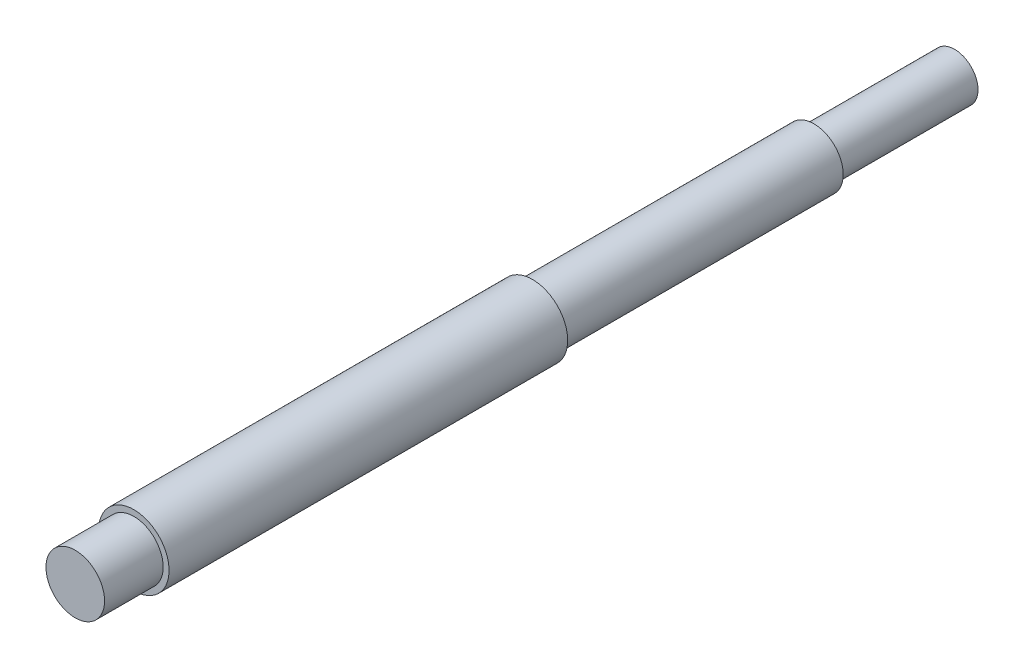
ISO-10303-21;
HEADER;
FILE_DESCRIPTION(('STEP AP214'),'2;1');
FILE_NAME('part.step','',(''),(''),'','','');
FILE_SCHEMA(('AUTOMOTIVE_DESIGN { 1 0 10303 214 1 1 1 1 }'));
ENDSEC;
DATA;
#1=APPLICATION_CONTEXT('core data for automotive mechanical design processes');
#2=APPLICATION_PROTOCOL_DEFINITION('international standard','automotive_design',2000,#1);
#3=PRODUCT_CONTEXT('',#1,'mechanical');
#4=PRODUCT('Part','Part','',(#3));
#5=PRODUCT_RELATED_PRODUCT_CATEGORY('part','',(#4));
#6=PRODUCT_DEFINITION_FORMATION('','',#4);
#7=PRODUCT_DEFINITION_CONTEXT('part definition',#1,'design');
#8=PRODUCT_DEFINITION('design','',#6,#7);
#9=PRODUCT_DEFINITION_SHAPE('','',#8);
#10=(LENGTH_UNIT() NAMED_UNIT(*) SI_UNIT(.MILLI.,.METRE.));
#11=(NAMED_UNIT(*) PLANE_ANGLE_UNIT() SI_UNIT($,.RADIAN.));
#12=(NAMED_UNIT(*) SI_UNIT($,.STERADIAN.) SOLID_ANGLE_UNIT());
#13=UNCERTAINTY_MEASURE_WITH_UNIT(LENGTH_MEASURE(1.E-05),#10,'distance_accuracy_value','');
#14=(GEOMETRIC_REPRESENTATION_CONTEXT(3) GLOBAL_UNCERTAINTY_ASSIGNED_CONTEXT((#13)) GLOBAL_UNIT_ASSIGNED_CONTEXT((#10,
#11,#12)) REPRESENTATION_CONTEXT('',''));
#15=CARTESIAN_POINT('',(0.,0.,0.));
#16=DIRECTION('',(0.,0.,1.));
#17=DIRECTION('',(1.,0.,0.));
#18=AXIS2_PLACEMENT_3D('',#15,#16,#17);
#19=CARTESIAN_POINT('',(0.,0.,5.));
#20=DIRECTION('',(0.,0.,-1.));
#21=DIRECTION('',(-1.,0.,0.));
#22=AXIS2_PLACEMENT_3D('',#19,#20,#21);
#23=CYLINDRICAL_SURFACE('',#22,2.5);
#24=CARTESIAN_POINT('',(0.,0.,5.));
#25=DIRECTION('',(0.,0.,1.));
#26=DIRECTION('',(1.,0.,0.));
#27=AXIS2_PLACEMENT_3D('',#24,#25,#26);
#28=CIRCLE('',#27,2.5);
#29=CARTESIAN_POINT('',(2.5,0.,5.));
#30=VERTEX_POINT('',#29);
#31=EDGE_CURVE('E49',#30,#30,#28,.T.);
#32=ORIENTED_EDGE('',*,*,#31,.F.);
#33=EDGE_LOOP('',(#32));
#34=FACE_BOUND('',#33,.T.);
#35=CARTESIAN_POINT('',(0.,0.,0.));
#36=DIRECTION('',(0.,0.,1.));
#37=DIRECTION('',(1.,0.,0.));
#38=AXIS2_PLACEMENT_3D('',#35,#36,#37);
#39=CIRCLE('',#38,2.5);
#40=CARTESIAN_POINT('',(2.5,0.,0.));
#41=VERTEX_POINT('',#40);
#42=EDGE_CURVE('E40',#41,#41,#39,.T.);
#43=ORIENTED_EDGE('',*,*,#42,.T.);
#44=EDGE_LOOP('',(#43));
#45=FACE_BOUND('',#44,.T.);
#46=ADVANCED_FACE('F37',(#34,#45),#23,.T.);
#47=CARTESIAN_POINT('',(0.,0.,5.));
#48=DIRECTION('',(0.,0.,1.));
#49=DIRECTION('',(1.,0.,0.));
#50=AXIS2_PLACEMENT_3D('',#47,#48,#49);
#51=PLANE('',#50);
#52=ORIENTED_EDGE('',*,*,#31,.T.);
#53=EDGE_LOOP('',(#52));
#54=FACE_BOUND('',#53,.T.);
#55=ADVANCED_FACE('F79',(#54),#51,.T.);
#56=CARTESIAN_POINT('',(0.,0.,-34.));
#57=DIRECTION('',(0.,0.,1.));
#58=DIRECTION('',(1.,0.,0.));
#59=AXIS2_PLACEMENT_3D('',#56,#57,#58);
#60=CYLINDRICAL_SURFACE('',#59,3.);
#61=CARTESIAN_POINT('',(0.,0.,-34.));
#62=DIRECTION('',(0.,0.,-1.));
#63=DIRECTION('',(-1.,0.,0.));
#64=AXIS2_PLACEMENT_3D('',#61,#62,#63);
#65=CIRCLE('',#64,3.);
#66=CARTESIAN_POINT('',(-3.,0.,-34.));
#67=VERTEX_POINT('',#66);
#68=EDGE_CURVE('E58',#67,#67,#65,.T.);
#69=ORIENTED_EDGE('',*,*,#68,.F.);
#70=EDGE_LOOP('',(#69));
#71=FACE_BOUND('',#70,.T.);
#72=CARTESIAN_POINT('',(0.,0.,0.));
#73=DIRECTION('',(0.,0.,-1.));
#74=DIRECTION('',(-1.,0.,0.));
#75=AXIS2_PLACEMENT_3D('',#72,#73,#74);
#76=CIRCLE('',#75,3.);
#77=CARTESIAN_POINT('',(-3.,0.,0.));
#78=VERTEX_POINT('',#77);
#79=EDGE_CURVE('E56',#78,#78,#76,.T.);
#80=ORIENTED_EDGE('',*,*,#79,.T.);
#81=EDGE_LOOP('',(#80));
#82=FACE_BOUND('',#81,.T.);
#83=ADVANCED_FACE('F77',(#71,#82),#60,.T.);
#84=CARTESIAN_POINT('',(0.,0.,-34.));
#85=DIRECTION('',(0.,0.,-1.));
#86=DIRECTION('',(-1.,0.,0.));
#87=AXIS2_PLACEMENT_3D('',#84,#85,#86);
#88=PLANE('',#87);
#89=CARTESIAN_POINT('',(0.,0.,-34.));
#90=DIRECTION('',(0.,0.,-1.));
#91=DIRECTION('',(-1.,0.,0.));
#92=AXIS2_PLACEMENT_3D('',#89,#90,#91);
#93=CIRCLE('',#92,2.5);
#94=CARTESIAN_POINT('',(-2.5,0.,-34.));
#95=VERTEX_POINT('',#94);
#96=EDGE_CURVE('E44',#95,#95,#93,.T.);
#97=ORIENTED_EDGE('',*,*,#96,.F.);
#98=EDGE_LOOP('',(#97));
#99=FACE_BOUND('',#98,.T.);
#100=ORIENTED_EDGE('',*,*,#68,.T.);
#101=EDGE_LOOP('',(#100));
#102=FACE_BOUND('',#101,.T.);
#103=ADVANCED_FACE('F73',(#99,#102),#88,.T.);
#104=CARTESIAN_POINT('',(0.,0.,0.));
#105=DIRECTION('',(0.,0.,-1.));
#106=DIRECTION('',(-1.,0.,0.));
#107=AXIS2_PLACEMENT_3D('',#104,#105,#106);
#108=PLANE('',#107);
#109=ORIENTED_EDGE('',*,*,#42,.F.);
#110=EDGE_LOOP('',(#109));
#111=FACE_BOUND('',#110,.T.);
#112=ORIENTED_EDGE('',*,*,#79,.F.);
#113=EDGE_LOOP('',(#112));
#114=FACE_BOUND('',#113,.T.);
#115=ADVANCED_FACE('F69',(#111,#114),#108,.F.);
#116=CARTESIAN_POINT('',(0.,0.,-58.));
#117=DIRECTION('',(0.,0.,1.));
#118=DIRECTION('',(1.,0.,0.));
#119=AXIS2_PLACEMENT_3D('',#116,#117,#118);
#120=CYLINDRICAL_SURFACE('',#119,2.5);
#121=CARTESIAN_POINT('',(0.,0.,-58.));
#122=DIRECTION('',(0.,0.,-1.));
#123=DIRECTION('',(-1.,0.,0.));
#124=AXIS2_PLACEMENT_3D('',#121,#122,#123);
#125=CIRCLE('',#124,2.5);
#126=CARTESIAN_POINT('',(-2.5,0.,-58.));
#127=VERTEX_POINT('',#126);
#128=EDGE_CURVE('E54',#127,#127,#125,.T.);
#129=ORIENTED_EDGE('',*,*,#128,.F.);
#130=EDGE_LOOP('',(#129));
#131=FACE_BOUND('',#130,.T.);
#132=ORIENTED_EDGE('',*,*,#96,.T.);
#133=EDGE_LOOP('',(#132));
#134=FACE_BOUND('',#133,.T.);
#135=ADVANCED_FACE('F72',(#131,#134),#120,.T.);
#136=CARTESIAN_POINT('',(0.,0.,-58.));
#137=DIRECTION('',(0.,0.,-1.));
#138=DIRECTION('',(-1.,0.,0.));
#139=AXIS2_PLACEMENT_3D('',#136,#137,#138);
#140=PLANE('',#139);
#141=CARTESIAN_POINT('',(0.,0.,-58.));
#142=DIRECTION('',(0.,0.,-1.));
#143=DIRECTION('',(-1.,0.,0.));
#144=AXIS2_PLACEMENT_3D('',#141,#142,#143);
#145=CIRCLE('',#144,2.);
#146=CARTESIAN_POINT('',(-2.,0.,-58.));
#147=VERTEX_POINT('',#146);
#148=EDGE_CURVE('E10',#147,#147,#145,.T.);
#149=ORIENTED_EDGE('',*,*,#148,.F.);
#150=EDGE_LOOP('',(#149));
#151=FACE_BOUND('',#150,.T.);
#152=ORIENTED_EDGE('',*,*,#128,.T.);
#153=EDGE_LOOP('',(#152));
#154=FACE_BOUND('',#153,.T.);
#155=ADVANCED_FACE('F126',(#151,#154),#140,.T.);
#156=CARTESIAN_POINT('',(0.,0.,-70.));
#157=DIRECTION('',(0.,0.,1.));
#158=DIRECTION('',(1.,0.,0.));
#159=AXIS2_PLACEMENT_3D('',#156,#157,#158);
#160=CYLINDRICAL_SURFACE('',#159,2.);
#161=CARTESIAN_POINT('',(0.,0.,-70.));
#162=DIRECTION('',(0.,0.,-1.));
#163=DIRECTION('',(-1.,0.,0.));
#164=AXIS2_PLACEMENT_3D('',#161,#162,#163);
#165=CIRCLE('',#164,2.);
#166=CARTESIAN_POINT('',(-2.,0.,-70.));
#167=VERTEX_POINT('',#166);
#168=EDGE_CURVE('E53',#167,#167,#165,.T.);
#169=ORIENTED_EDGE('',*,*,#168,.F.);
#170=EDGE_LOOP('',(#169));
#171=FACE_BOUND('',#170,.T.);
#172=ORIENTED_EDGE('',*,*,#148,.T.);
#173=EDGE_LOOP('',(#172));
#174=FACE_BOUND('',#173,.T.);
#175=ADVANCED_FACE('F137',(#171,#174),#160,.T.);
#176=CARTESIAN_POINT('',(0.,0.,-70.));
#177=DIRECTION('',(0.,0.,-1.));
#178=DIRECTION('',(-1.,0.,0.));
#179=AXIS2_PLACEMENT_3D('',#176,#177,#178);
#180=PLANE('',#179);
#181=ORIENTED_EDGE('',*,*,#168,.T.);
#182=EDGE_LOOP('',(#181));
#183=FACE_BOUND('',#182,.T.);
#184=ADVANCED_FACE('F148',(#183),#180,.T.);
#185=CLOSED_SHELL('',(#46,#55,#83,#103,#115,#135,#155,#175,#184));
#186=MANIFOLD_SOLID_BREP('B2',#185);
#187=ADVANCED_BREP_SHAPE_REPRESENTATION('',(#18,#186),#14);
#188=SHAPE_DEFINITION_REPRESENTATION(#9,#187);
ENDSEC;
END-ISO-10303-21;
